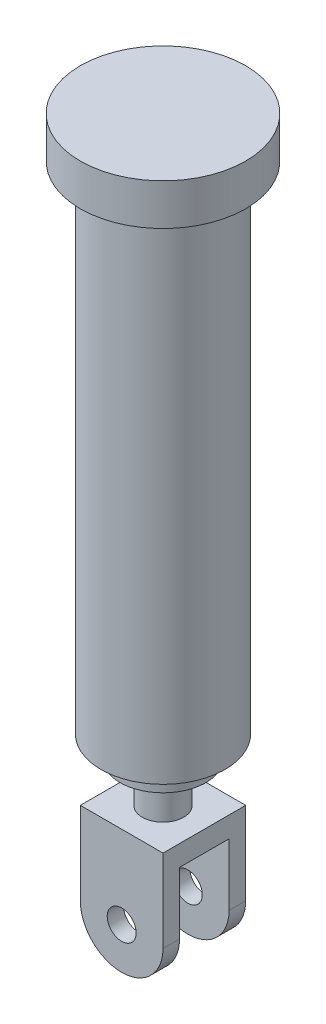
ISO-10303-21;
HEADER;
FILE_DESCRIPTION(('STEP AP214'),'2;1');
FILE_NAME('part.step','',(''),(''),'','','');
FILE_SCHEMA(('AUTOMOTIVE_DESIGN { 1 0 10303 214 1 1 1 1 }'));
ENDSEC;
DATA;
#1=APPLICATION_CONTEXT('core data for automotive mechanical design processes');
#2=APPLICATION_PROTOCOL_DEFINITION('international standard','automotive_design',2000,#1);
#3=PRODUCT_CONTEXT('',#1,'mechanical');
#4=PRODUCT('Part','Part','',(#3));
#5=PRODUCT_RELATED_PRODUCT_CATEGORY('part','',(#4));
#6=PRODUCT_DEFINITION_FORMATION('','',#4);
#7=PRODUCT_DEFINITION_CONTEXT('part definition',#1,'design');
#8=PRODUCT_DEFINITION('design','',#6,#7);
#9=PRODUCT_DEFINITION_SHAPE('','',#8);
#10=(LENGTH_UNIT() NAMED_UNIT(*) SI_UNIT(.MILLI.,.METRE.));
#11=(NAMED_UNIT(*) PLANE_ANGLE_UNIT() SI_UNIT($,.RADIAN.));
#12=(NAMED_UNIT(*) SI_UNIT($,.STERADIAN.) SOLID_ANGLE_UNIT());
#13=UNCERTAINTY_MEASURE_WITH_UNIT(LENGTH_MEASURE(1.E-05),#10,'distance_accuracy_value','');
#14=(GEOMETRIC_REPRESENTATION_CONTEXT(3) GLOBAL_UNCERTAINTY_ASSIGNED_CONTEXT((#13)) GLOBAL_UNIT_ASSIGNED_CONTEXT((#10,
#11,#12)) REPRESENTATION_CONTEXT('',''));
#15=CARTESIAN_POINT('',(0.,0.,0.));
#16=DIRECTION('',(0.,0.,1.));
#17=DIRECTION('',(1.,0.,0.));
#18=AXIS2_PLACEMENT_3D('',#15,#16,#17);
#19=CARTESIAN_POINT('',(0.,-165.,10.));
#20=DIRECTION('',(0.,0.,-1.));
#21=DIRECTION('',(-1.,0.,0.));
#22=AXIS2_PLACEMENT_3D('',#19,#20,#21);
#23=CYLINDRICAL_SURFACE('',#22,10.);
#24=CARTESIAN_POINT('',(0.,-165.,6.));
#25=DIRECTION('',(0.,0.,1.));
#26=DIRECTION('',(1.,0.,0.));
#27=AXIS2_PLACEMENT_3D('',#24,#25,#26);
#28=CIRCLE('',#27,10.);
#29=CARTESIAN_POINT('',(10.,-165.,6.));
#30=VERTEX_POINT('',#29);
#31=CARTESIAN_POINT('',(-10.,-165.,6.));
#32=VERTEX_POINT('',#31);
#33=EDGE_CURVE('E170',#30,#32,#28,.F.);
#34=ORIENTED_EDGE('',*,*,#33,.F.);
#35=DIRECTION('',(0.,0.,-1.));
#36=VECTOR('',#35,1.);
#37=CARTESIAN_POINT('',(10.,-165.,10.));
#38=LINE('',#37,#36);
#39=CARTESIAN_POINT('',(10.,-165.,10.));
#40=VERTEX_POINT('',#39);
#41=EDGE_CURVE('E166',#40,#30,#38,.T.);
#42=ORIENTED_EDGE('',*,*,#41,.F.);
#43=CARTESIAN_POINT('',(0.,-165.,10.));
#44=DIRECTION('',(0.,0.,-1.));
#45=DIRECTION('',(-1.,0.,0.));
#46=AXIS2_PLACEMENT_3D('',#43,#44,#45);
#47=CIRCLE('',#46,10.);
#48=CARTESIAN_POINT('',(-10.,-165.,10.));
#49=VERTEX_POINT('',#48);
#50=EDGE_CURVE('E190',#40,#49,#47,.T.);
#51=ORIENTED_EDGE('',*,*,#50,.T.);
#52=DIRECTION('',(0.,0.,-1.));
#53=VECTOR('',#52,1.);
#54=CARTESIAN_POINT('',(-10.,-165.,10.));
#55=LINE('',#54,#53);
#56=EDGE_CURVE('E198',#49,#32,#55,.T.);
#57=ORIENTED_EDGE('',*,*,#56,.T.);
#58=EDGE_LOOP('',(#34,#42,#51,#57));
#59=FACE_BOUND('',#58,.T.);
#60=ADVANCED_FACE('F74',(#59),#23,.T.);
#61=CARTESIAN_POINT('',(0.,-165.,10.));
#62=DIRECTION('',(0.,0.,-1.));
#63=DIRECTION('',(-1.,0.,0.));
#64=AXIS2_PLACEMENT_3D('',#61,#62,#63);
#65=CYLINDRICAL_SURFACE('',#64,3.5);
#66=CARTESIAN_POINT('',(0.,-165.,6.));
#67=DIRECTION('',(0.,0.,1.));
#68=DIRECTION('',(1.,0.,0.));
#69=AXIS2_PLACEMENT_3D('',#66,#67,#68);
#70=CIRCLE('',#69,3.5);
#71=CARTESIAN_POINT('',(3.5,-165.,6.));
#72=VERTEX_POINT('',#71);
#73=EDGE_CURVE('E175',#72,#72,#70,.F.);
#74=ORIENTED_EDGE('',*,*,#73,.T.);
#75=EDGE_LOOP('',(#74));
#76=FACE_BOUND('',#75,.T.);
#77=CARTESIAN_POINT('',(0.,-165.,10.));
#78=DIRECTION('',(0.,0.,-1.));
#79=DIRECTION('',(-1.,0.,0.));
#80=AXIS2_PLACEMENT_3D('',#77,#78,#79);
#81=CIRCLE('',#80,3.5);
#82=CARTESIAN_POINT('',(-3.5,-165.,10.));
#83=VERTEX_POINT('',#82);
#84=EDGE_CURVE('E182',#83,#83,#81,.T.);
#85=ORIENTED_EDGE('',*,*,#84,.F.);
#86=EDGE_LOOP('',(#85));
#87=FACE_BOUND('',#86,.T.);
#88=ADVANCED_FACE('F300',(#76,#87),#65,.F.);
#89=CARTESIAN_POINT('',(0.,-10.,0.));
#90=DIRECTION('',(0.,1.,0.));
#91=DIRECTION('',(0.,0.,1.));
#92=AXIS2_PLACEMENT_3D('',#89,#90,#91);
#93=CYLINDRICAL_SURFACE('',#92,20.);
#94=CARTESIAN_POINT('',(0.,-10.,0.));
#95=DIRECTION('',(0.,1.,0.));
#96=DIRECTION('',(0.,0.,1.));
#97=AXIS2_PLACEMENT_3D('',#94,#95,#96);
#98=CIRCLE('',#97,20.);
#99=CARTESIAN_POINT('',(0.,-10.,20.));
#100=VERTEX_POINT('',#99);
#101=EDGE_CURVE('E256',#100,#100,#98,.T.);
#102=ORIENTED_EDGE('',*,*,#101,.T.);
#103=EDGE_LOOP('',(#102));
#104=FACE_BOUND('',#103,.T.);
#105=CARTESIAN_POINT('',(0.,0.,0.));
#106=DIRECTION('',(0.,1.,0.));
#107=DIRECTION('',(0.,0.,1.));
#108=AXIS2_PLACEMENT_3D('',#105,#106,#107);
#109=CIRCLE('',#108,20.);
#110=CARTESIAN_POINT('',(0.,0.,20.));
#111=VERTEX_POINT('',#110);
#112=EDGE_CURVE('E252',#111,#111,#109,.T.);
#113=ORIENTED_EDGE('',*,*,#112,.F.);
#114=EDGE_LOOP('',(#113));
#115=FACE_BOUND('',#114,.T.);
#116=ADVANCED_FACE('F76',(#104,#115),#93,.T.);
#117=CARTESIAN_POINT('',(0.,-10.,0.));
#118=DIRECTION('',(0.,1.,0.));
#119=DIRECTION('',(0.,0.,1.));
#120=AXIS2_PLACEMENT_3D('',#117,#118,#119);
#121=PLANE('',#120);
#122=CARTESIAN_POINT('',(0.,-10.,0.));
#123=DIRECTION('',(0.,-1.,0.));
#124=DIRECTION('',(0.,0.,-1.));
#125=AXIS2_PLACEMENT_3D('',#122,#123,#124);
#126=CIRCLE('',#125,15.);
#127=CARTESIAN_POINT('',(0.,-10.,-15.));
#128=VERTEX_POINT('',#127);
#129=EDGE_CURVE('E248',#128,#128,#126,.T.);
#130=ORIENTED_EDGE('',*,*,#129,.F.);
#131=EDGE_LOOP('',(#130));
#132=FACE_BOUND('',#131,.T.);
#133=ORIENTED_EDGE('',*,*,#101,.F.);
#134=EDGE_LOOP('',(#133));
#135=FACE_BOUND('',#134,.T.);
#136=ADVANCED_FACE('F444',(#132,#135),#121,.F.);
#137=CARTESIAN_POINT('',(0.,0.,0.));
#138=DIRECTION('',(0.,1.,0.));
#139=DIRECTION('',(0.,0.,1.));
#140=AXIS2_PLACEMENT_3D('',#137,#138,#139);
#141=PLANE('',#140);
#142=ORIENTED_EDGE('',*,*,#112,.T.);
#143=EDGE_LOOP('',(#142));
#144=FACE_BOUND('',#143,.T.);
#145=ADVANCED_FACE('F435',(#144),#141,.T.);
#146=CARTESIAN_POINT('',(0.,-130.,0.));
#147=DIRECTION('',(0.,1.,0.));
#148=DIRECTION('',(0.,0.,1.));
#149=AXIS2_PLACEMENT_3D('',#146,#147,#148);
#150=CYLINDRICAL_SURFACE('',#149,15.);
#151=CARTESIAN_POINT('',(0.,-130.,0.));
#152=DIRECTION('',(0.,-1.,0.));
#153=DIRECTION('',(0.,0.,-1.));
#154=AXIS2_PLACEMENT_3D('',#151,#152,#153);
#155=CIRCLE('',#154,15.);
#156=CARTESIAN_POINT('',(0.,-130.,-15.));
#157=VERTEX_POINT('',#156);
#158=EDGE_CURVE('E244',#157,#157,#155,.T.);
#159=ORIENTED_EDGE('',*,*,#158,.F.);
#160=EDGE_LOOP('',(#159));
#161=FACE_BOUND('',#160,.T.);
#162=ORIENTED_EDGE('',*,*,#129,.T.);
#163=EDGE_LOOP('',(#162));
#164=FACE_BOUND('',#163,.T.);
#165=ADVANCED_FACE('F425',(#161,#164),#150,.T.);
#166=CARTESIAN_POINT('',(0.,-130.,0.));
#167=DIRECTION('',(0.,-1.,0.));
#168=DIRECTION('',(0.,0.,-1.));
#169=AXIS2_PLACEMENT_3D('',#166,#167,#168);
#170=PLANE('',#169);
#171=CARTESIAN_POINT('',(0.,-130.,0.));
#172=DIRECTION('',(0.,-1.,0.));
#173=DIRECTION('',(0.,0.,-1.));
#174=AXIS2_PLACEMENT_3D('',#171,#172,#173);
#175=CIRCLE('',#174,10.4358710309692);
#176=CARTESIAN_POINT('',(0.,-130.,-10.4358710309692));
#177=VERTEX_POINT('',#176);
#178=EDGE_CURVE('E240',#177,#177,#175,.T.);
#179=ORIENTED_EDGE('',*,*,#178,.F.);
#180=EDGE_LOOP('',(#179));
#181=FACE_BOUND('',#180,.T.);
#182=ORIENTED_EDGE('',*,*,#158,.T.);
#183=EDGE_LOOP('',(#182));
#184=FACE_BOUND('',#183,.T.);
#185=ADVANCED_FACE('F415',(#181,#184),#170,.T.);
#186=CARTESIAN_POINT('',(0.,-135.,0.));
#187=DIRECTION('',(0.,1.,0.));
#188=DIRECTION('',(0.,0.,1.));
#189=AXIS2_PLACEMENT_3D('',#186,#187,#188);
#190=CYLINDRICAL_SURFACE('',#189,10.4358710309692);
#191=CARTESIAN_POINT('',(0.,-135.,0.));
#192=DIRECTION('',(0.,-1.,0.));
#193=DIRECTION('',(0.,0.,-1.));
#194=AXIS2_PLACEMENT_3D('',#191,#192,#193);
#195=CIRCLE('',#194,10.4358710309692);
#196=CARTESIAN_POINT('',(0.,-135.,-10.4358710309692));
#197=VERTEX_POINT('',#196);
#198=EDGE_CURVE('E236',#197,#197,#195,.T.);
#199=ORIENTED_EDGE('',*,*,#198,.F.);
#200=EDGE_LOOP('',(#199));
#201=FACE_BOUND('',#200,.T.);
#202=ORIENTED_EDGE('',*,*,#178,.T.);
#203=EDGE_LOOP('',(#202));
#204=FACE_BOUND('',#203,.T.);
#205=ADVANCED_FACE('F406',(#201,#204),#190,.T.);
#206=CARTESIAN_POINT('',(0.,-135.,0.));
#207=DIRECTION('',(0.,-1.,0.));
#208=DIRECTION('',(0.,0.,-1.));
#209=AXIS2_PLACEMENT_3D('',#206,#207,#208);
#210=PLANE('',#209);
#211=CARTESIAN_POINT('',(0.,-135.,0.));
#212=DIRECTION('',(0.,-1.,0.));
#213=DIRECTION('',(0.,0.,-1.));
#214=AXIS2_PLACEMENT_3D('',#211,#212,#213);
#215=CIRCLE('',#214,5.);
#216=CARTESIAN_POINT('',(0.,-135.,-5.));
#217=VERTEX_POINT('',#216);
#218=EDGE_CURVE('E83',#217,#217,#215,.T.);
#219=ORIENTED_EDGE('',*,*,#218,.F.);
#220=EDGE_LOOP('',(#219));
#221=FACE_BOUND('',#220,.T.);
#222=ORIENTED_EDGE('',*,*,#198,.T.);
#223=EDGE_LOOP('',(#222));
#224=FACE_BOUND('',#223,.T.);
#225=ADVANCED_FACE('F397',(#221,#224),#210,.T.);
#226=CARTESIAN_POINT('',(0.,-145.,0.));
#227=DIRECTION('',(0.,1.,0.));
#228=DIRECTION('',(0.,0.,1.));
#229=AXIS2_PLACEMENT_3D('',#226,#227,#228);
#230=CYLINDRICAL_SURFACE('',#229,5.);
#231=CARTESIAN_POINT('',(0.,-145.,0.));
#232=DIRECTION('',(0.,-1.,0.));
#233=DIRECTION('',(0.,0.,-1.));
#234=AXIS2_PLACEMENT_3D('',#231,#232,#233);
#235=CIRCLE('',#234,5.);
#236=CARTESIAN_POINT('',(0.,-145.,-5.));
#237=VERTEX_POINT('',#236);
#238=EDGE_CURVE('E223',#237,#237,#235,.T.);
#239=ORIENTED_EDGE('',*,*,#238,.F.);
#240=EDGE_LOOP('',(#239));
#241=FACE_BOUND('',#240,.T.);
#242=ORIENTED_EDGE('',*,*,#218,.T.);
#243=EDGE_LOOP('',(#242));
#244=FACE_BOUND('',#243,.T.);
#245=ADVANCED_FACE('F388',(#241,#244),#230,.T.);
#246=CARTESIAN_POINT('',(-10.,-150.,10.));
#247=DIRECTION('',(0.,0.,1.));
#248=DIRECTION('',(1.,0.,0.));
#249=AXIS2_PLACEMENT_3D('',#246,#247,#248);
#250=PLANE('',#249);
#251=DIRECTION('',(1.,0.,0.));
#252=VECTOR('',#251,1.);
#253=CARTESIAN_POINT('',(-10.,-145.,10.));
#254=LINE('',#253,#252);
#255=CARTESIAN_POINT('',(-10.,-145.,10.));
#256=VERTEX_POINT('',#255);
#257=CARTESIAN_POINT('',(10.,-145.,10.));
#258=VERTEX_POINT('',#257);
#259=EDGE_CURVE('E202',#256,#258,#254,.T.);
#260=ORIENTED_EDGE('',*,*,#259,.F.);
#261=DIRECTION('',(0.,1.,0.));
#262=VECTOR('',#261,1.);
#263=CARTESIAN_POINT('',(-10.,-150.,10.));
#264=LINE('',#263,#262);
#265=EDGE_CURVE('E98',#49,#256,#264,.T.);
#266=ORIENTED_EDGE('',*,*,#265,.F.);
#267=ORIENTED_EDGE('',*,*,#50,.F.);
#268=DIRECTION('',(0.,1.,0.));
#269=VECTOR('',#268,1.);
#270=CARTESIAN_POINT('',(10.,-150.,10.));
#271=LINE('',#270,#269);
#272=EDGE_CURVE('E220',#40,#258,#271,.T.);
#273=ORIENTED_EDGE('',*,*,#272,.T.);
#274=EDGE_LOOP('',(#260,#266,#267,#273));
#275=FACE_BOUND('',#274,.T.);
#276=ORIENTED_EDGE('',*,*,#84,.T.);
#277=EDGE_LOOP('',(#276));
#278=FACE_BOUND('',#277,.T.);
#279=ADVANCED_FACE('F344',(#275,#278),#250,.T.);
#280=CARTESIAN_POINT('',(-10.,-150.,-10.));
#281=DIRECTION('',(-1.,0.,0.));
#282=DIRECTION('',(0.,0.,1.));
#283=AXIS2_PLACEMENT_3D('',#280,#281,#282);
#284=PLANE('',#283);
#285=DIRECTION('',(0.,1.,0.));
#286=VECTOR('',#285,1.);
#287=CARTESIAN_POINT('',(-10.,-150.,6.));
#288=LINE('',#287,#286);
#289=CARTESIAN_POINT('',(-10.,-150.,6.));
#290=VERTEX_POINT('',#289);
#291=EDGE_CURVE('E169',#32,#290,#288,.T.);
#292=ORIENTED_EDGE('',*,*,#291,.F.);
#293=ORIENTED_EDGE('',*,*,#56,.F.);
#294=ORIENTED_EDGE('',*,*,#265,.T.);
#295=DIRECTION('',(0.,0.,1.));
#296=VECTOR('',#295,1.);
#297=CARTESIAN_POINT('',(-10.,-145.,-10.));
#298=LINE('',#297,#296);
#299=CARTESIAN_POINT('',(-10.,-145.,-10.));
#300=VERTEX_POINT('',#299);
#301=EDGE_CURVE('E216',#300,#256,#298,.T.);
#302=ORIENTED_EDGE('',*,*,#301,.F.);
#303=DIRECTION('',(0.,1.,0.));
#304=VECTOR('',#303,1.);
#305=CARTESIAN_POINT('',(-10.,-150.,-10.));
#306=LINE('',#305,#304);
#307=CARTESIAN_POINT('',(-10.,-165.,-10.));
#308=VERTEX_POINT('',#307);
#309=EDGE_CURVE('E224',#308,#300,#306,.T.);
#310=ORIENTED_EDGE('',*,*,#309,.F.);
#311=CARTESIAN_POINT('',(-10.,-165.,-6.));
#312=VERTEX_POINT('',#311);
#313=EDGE_CURVE('E203',#312,#308,#55,.T.);
#314=ORIENTED_EDGE('',*,*,#313,.F.);
#315=DIRECTION('',(0.,-1.,0.));
#316=VECTOR('',#315,1.);
#317=CARTESIAN_POINT('',(-10.,-150.,-6.));
#318=LINE('',#317,#316);
#319=CARTESIAN_POINT('',(-10.,-150.,-6.));
#320=VERTEX_POINT('',#319);
#321=EDGE_CURVE('E90',#320,#312,#318,.T.);
#322=ORIENTED_EDGE('',*,*,#321,.F.);
#323=DIRECTION('',(0.,0.,-1.));
#324=VECTOR('',#323,1.);
#325=CARTESIAN_POINT('',(-10.,-150.,-10.));
#326=LINE('',#325,#324);
#327=EDGE_CURVE('E155',#290,#320,#326,.T.);
#328=ORIENTED_EDGE('',*,*,#327,.F.);
#329=EDGE_LOOP('',(#292,#293,#294,#302,#310,#314,#322,#328));
#330=FACE_BOUND('',#329,.T.);
#331=ADVANCED_FACE('F275',(#330),#284,.T.);
#332=CARTESIAN_POINT('',(-10.,-150.,-10.));
#333=DIRECTION('',(0.,0.,1.));
#334=DIRECTION('',(1.,0.,0.));
#335=AXIS2_PLACEMENT_3D('',#332,#333,#334);
#336=PLANE('',#335);
#337=DIRECTION('',(1.,0.,0.));
#338=VECTOR('',#337,1.);
#339=CARTESIAN_POINT('',(-10.,-145.,-10.));
#340=LINE('',#339,#338);
#341=CARTESIAN_POINT('',(10.,-145.,-10.));
#342=VERTEX_POINT('',#341);
#343=EDGE_CURVE('E213',#300,#342,#340,.T.);
#344=ORIENTED_EDGE('',*,*,#343,.T.);
#345=DIRECTION('',(0.,1.,0.));
#346=VECTOR('',#345,1.);
#347=CARTESIAN_POINT('',(10.,-150.,-10.));
#348=LINE('',#347,#346);
#349=CARTESIAN_POINT('',(10.,-165.,-10.));
#350=VERTEX_POINT('',#349);
#351=EDGE_CURVE('E227',#350,#342,#348,.T.);
#352=ORIENTED_EDGE('',*,*,#351,.F.);
#353=CARTESIAN_POINT('',(0.,-165.,-10.));
#354=DIRECTION('',(0.,0.,-1.));
#355=DIRECTION('',(-1.,0.,0.));
#356=AXIS2_PLACEMENT_3D('',#353,#354,#355);
#357=CIRCLE('',#356,10.);
#358=EDGE_CURVE('E186',#350,#308,#357,.T.);
#359=ORIENTED_EDGE('',*,*,#358,.T.);
#360=ORIENTED_EDGE('',*,*,#309,.T.);
#361=EDGE_LOOP('',(#344,#352,#359,#360));
#362=FACE_BOUND('',#361,.T.);
#363=CARTESIAN_POINT('',(0.,-165.,-10.));
#364=DIRECTION('',(0.,0.,-1.));
#365=DIRECTION('',(-1.,0.,0.));
#366=AXIS2_PLACEMENT_3D('',#363,#364,#365);
#367=CIRCLE('',#366,3.5);
#368=CARTESIAN_POINT('',(-3.5,-165.,-10.));
#369=VERTEX_POINT('',#368);
#370=EDGE_CURVE('E181',#369,#369,#367,.T.);
#371=ORIENTED_EDGE('',*,*,#370,.F.);
#372=EDGE_LOOP('',(#371));
#373=FACE_BOUND('',#372,.T.);
#374=ADVANCED_FACE('F285',(#362,#373),#336,.F.);
#375=CARTESIAN_POINT('',(10.,-150.,-10.));
#376=DIRECTION('',(-1.,0.,0.));
#377=DIRECTION('',(0.,0.,1.));
#378=AXIS2_PLACEMENT_3D('',#375,#376,#377);
#379=PLANE('',#378);
#380=ORIENTED_EDGE('',*,*,#41,.T.);
#381=DIRECTION('',(0.,1.,0.));
#382=VECTOR('',#381,1.);
#383=CARTESIAN_POINT('',(10.,-150.,6.));
#384=LINE('',#383,#382);
#385=CARTESIAN_POINT('',(10.,-150.,6.));
#386=VERTEX_POINT('',#385);
#387=EDGE_CURVE('E164',#30,#386,#384,.T.);
#388=ORIENTED_EDGE('',*,*,#387,.T.);
#389=DIRECTION('',(0.,0.,-1.));
#390=VECTOR('',#389,1.);
#391=CARTESIAN_POINT('',(10.,-150.,-10.));
#392=LINE('',#391,#390);
#393=CARTESIAN_POINT('',(10.,-150.,-6.));
#394=VERTEX_POINT('',#393);
#395=EDGE_CURVE('E12',#386,#394,#392,.T.);
#396=ORIENTED_EDGE('',*,*,#395,.T.);
#397=DIRECTION('',(0.,-1.,0.));
#398=VECTOR('',#397,1.);
#399=CARTESIAN_POINT('',(10.,-150.,-6.));
#400=LINE('',#399,#398);
#401=CARTESIAN_POINT('',(10.,-165.,-6.));
#402=VERTEX_POINT('',#401);
#403=EDGE_CURVE('E140',#394,#402,#400,.T.);
#404=ORIENTED_EDGE('',*,*,#403,.T.);
#405=EDGE_CURVE('E194',#402,#350,#38,.T.);
#406=ORIENTED_EDGE('',*,*,#405,.T.);
#407=ORIENTED_EDGE('',*,*,#351,.T.);
#408=DIRECTION('',(0.,0.,1.));
#409=VECTOR('',#408,1.);
#410=CARTESIAN_POINT('',(10.,-145.,-10.));
#411=LINE('',#410,#409);
#412=EDGE_CURVE('E209',#342,#258,#411,.T.);
#413=ORIENTED_EDGE('',*,*,#412,.T.);
#414=ORIENTED_EDGE('',*,*,#272,.F.);
#415=EDGE_LOOP('',(#380,#388,#396,#404,#406,#407,#413,#414));
#416=FACE_BOUND('',#415,.T.);
#417=ADVANCED_FACE('F162',(#416),#379,.F.);
#418=CARTESIAN_POINT('',(0.,-145.,0.));
#419=DIRECTION('',(0.,-1.,0.));
#420=DIRECTION('',(0.,0.,-1.));
#421=AXIS2_PLACEMENT_3D('',#418,#419,#420);
#422=PLANE('',#421);
#423=ORIENTED_EDGE('',*,*,#238,.T.);
#424=EDGE_LOOP('',(#423));
#425=FACE_BOUND('',#424,.T.);
#426=ORIENTED_EDGE('',*,*,#259,.T.);
#427=ORIENTED_EDGE('',*,*,#412,.F.);
#428=ORIENTED_EDGE('',*,*,#343,.F.);
#429=ORIENTED_EDGE('',*,*,#301,.T.);
#430=EDGE_LOOP('',(#426,#427,#428,#429));
#431=FACE_BOUND('',#430,.T.);
#432=ADVANCED_FACE('F291',(#425,#431),#422,.F.);
#433=ORIENTED_EDGE('',*,*,#405,.F.);
#434=CARTESIAN_POINT('',(0.,-165.,-6.));
#435=DIRECTION('',(0.,0.,-1.));
#436=DIRECTION('',(-1.,0.,0.));
#437=AXIS2_PLACEMENT_3D('',#434,#435,#436);
#438=CIRCLE('',#437,10.);
#439=EDGE_CURVE('E145',#312,#402,#438,.F.);
#440=ORIENTED_EDGE('',*,*,#439,.F.);
#441=ORIENTED_EDGE('',*,*,#313,.T.);
#442=ORIENTED_EDGE('',*,*,#358,.F.);
#443=EDGE_LOOP('',(#433,#440,#441,#442));
#444=FACE_BOUND('',#443,.T.);
#445=ADVANCED_FACE('F288',(#444),#23,.T.);
#446=CARTESIAN_POINT('',(0.,-165.,-6.));
#447=DIRECTION('',(0.,0.,-1.));
#448=DIRECTION('',(-1.,0.,0.));
#449=AXIS2_PLACEMENT_3D('',#446,#447,#448);
#450=CIRCLE('',#449,3.5);
#451=CARTESIAN_POINT('',(-3.5,-165.,-6.));
#452=VERTEX_POINT('',#451);
#453=EDGE_CURVE('E157',#452,#452,#450,.F.);
#454=ORIENTED_EDGE('',*,*,#453,.T.);
#455=EDGE_LOOP('',(#454));
#456=FACE_BOUND('',#455,.T.);
#457=ORIENTED_EDGE('',*,*,#370,.T.);
#458=EDGE_LOOP('',(#457));
#459=FACE_BOUND('',#458,.T.);
#460=ADVANCED_FACE('F290',(#456,#459),#65,.F.);
#461=CARTESIAN_POINT('',(17.,-150.,6.));
#462=DIRECTION('',(0.,1.,0.));
#463=DIRECTION('',(0.,0.,1.));
#464=AXIS2_PLACEMENT_3D('',#461,#462,#463);
#465=PLANE('',#464);
#466=ORIENTED_EDGE('',*,*,#327,.T.);
#467=DIRECTION('',(-1.,0.,0.));
#468=VECTOR('',#467,1.);
#469=CARTESIAN_POINT('',(17.,-150.,-6.));
#470=LINE('',#469,#468);
#471=EDGE_CURVE('E144',#394,#320,#470,.T.);
#472=ORIENTED_EDGE('',*,*,#471,.F.);
#473=ORIENTED_EDGE('',*,*,#395,.F.);
#474=DIRECTION('',(-1.,0.,0.));
#475=VECTOR('',#474,1.);
#476=CARTESIAN_POINT('',(17.,-150.,6.));
#477=LINE('',#476,#475);
#478=EDGE_CURVE('E158',#386,#290,#477,.T.);
#479=ORIENTED_EDGE('',*,*,#478,.T.);
#480=EDGE_LOOP('',(#466,#472,#473,#479));
#481=FACE_BOUND('',#480,.T.);
#482=ADVANCED_FACE('F151',(#481),#465,.F.);
#483=CARTESIAN_POINT('',(17.,-175.,6.));
#484=DIRECTION('',(0.,0.,1.));
#485=DIRECTION('',(1.,0.,0.));
#486=AXIS2_PLACEMENT_3D('',#483,#484,#485);
#487=PLANE('',#486);
#488=ORIENTED_EDGE('',*,*,#291,.T.);
#489=ORIENTED_EDGE('',*,*,#478,.F.);
#490=ORIENTED_EDGE('',*,*,#387,.F.);
#491=ORIENTED_EDGE('',*,*,#33,.T.);
#492=EDGE_LOOP('',(#488,#489,#490,#491));
#493=FACE_BOUND('',#492,.T.);
#494=ORIENTED_EDGE('',*,*,#73,.F.);
#495=EDGE_LOOP('',(#494));
#496=FACE_BOUND('',#495,.T.);
#497=ADVANCED_FACE('F312',(#493,#496),#487,.F.);
#498=CARTESIAN_POINT('',(17.,-175.,-6.));
#499=DIRECTION('',(0.,0.,-1.));
#500=DIRECTION('',(-1.,0.,0.));
#501=AXIS2_PLACEMENT_3D('',#498,#499,#500);
#502=PLANE('',#501);
#503=ORIENTED_EDGE('',*,*,#321,.T.);
#504=ORIENTED_EDGE('',*,*,#439,.T.);
#505=ORIENTED_EDGE('',*,*,#403,.F.);
#506=ORIENTED_EDGE('',*,*,#471,.T.);
#507=EDGE_LOOP('',(#503,#504,#505,#506));
#508=FACE_BOUND('',#507,.T.);
#509=ORIENTED_EDGE('',*,*,#453,.F.);
#510=EDGE_LOOP('',(#509));
#511=FACE_BOUND('',#510,.T.);
#512=ADVANCED_FACE('F142',(#508,#511),#502,.F.);
#513=CLOSED_SHELL('',(#60,#88,#116,#136,#145,#165,#185,#205,#225,#245,#279,#331,#374,#417,#432,
#445,#460,#482,#497,#512));
#514=MANIFOLD_SOLID_BREP('B2',#513);
#515=ADVANCED_BREP_SHAPE_REPRESENTATION('',(#18,#514),#14);
#516=SHAPE_DEFINITION_REPRESENTATION(#9,#515);
ENDSEC;
END-ISO-10303-21;
